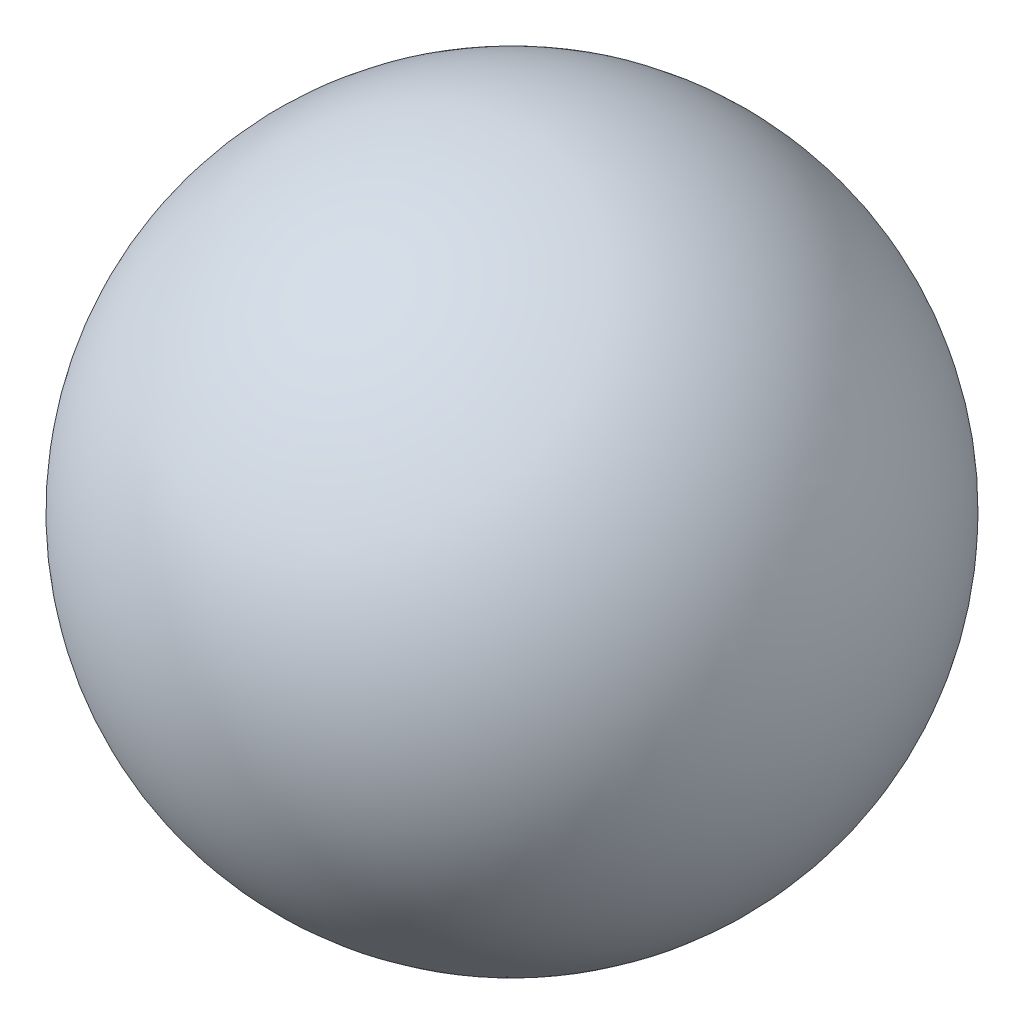
ISO-10303-21;
HEADER;
FILE_DESCRIPTION(('STEP AP214'),'2;1');
FILE_NAME('part.step','',(''),(''),'','','');
FILE_SCHEMA(('AUTOMOTIVE_DESIGN { 1 0 10303 214 1 1 1 1 }'));
ENDSEC;
DATA;
#1=APPLICATION_CONTEXT('core data for automotive mechanical design processes');
#2=APPLICATION_PROTOCOL_DEFINITION('international standard','automotive_design',2000,#1);
#3=PRODUCT_CONTEXT('',#1,'mechanical');
#4=PRODUCT('Part','Part','',(#3));
#5=PRODUCT_RELATED_PRODUCT_CATEGORY('part','',(#4));
#6=PRODUCT_DEFINITION_FORMATION('','',#4);
#7=PRODUCT_DEFINITION_CONTEXT('part definition',#1,'design');
#8=PRODUCT_DEFINITION('design','',#6,#7);
#9=PRODUCT_DEFINITION_SHAPE('','',#8);
#10=(LENGTH_UNIT() NAMED_UNIT(*) SI_UNIT(.MILLI.,.METRE.));
#11=(NAMED_UNIT(*) PLANE_ANGLE_UNIT() SI_UNIT($,.RADIAN.));
#12=(NAMED_UNIT(*) SI_UNIT($,.STERADIAN.) SOLID_ANGLE_UNIT());
#13=UNCERTAINTY_MEASURE_WITH_UNIT(LENGTH_MEASURE(1.E-05),#10,'distance_accuracy_value','');
#14=(GEOMETRIC_REPRESENTATION_CONTEXT(3) GLOBAL_UNCERTAINTY_ASSIGNED_CONTEXT((#13)) GLOBAL_UNIT_ASSIGNED_CONTEXT((#10,
#11,#12)) REPRESENTATION_CONTEXT('',''));
#15=CARTESIAN_POINT('',(0.,0.,0.));
#16=DIRECTION('',(0.,0.,1.));
#17=DIRECTION('',(1.,0.,0.));
#18=AXIS2_PLACEMENT_3D('',#15,#16,#17);
#19=CARTESIAN_POINT('',(0.,-6.45,0.));
#20=DIRECTION('',(0.,1.,0.));
#21=DIRECTION('',(-1.,0.,0.));
#22=AXIS2_PLACEMENT_3D('',#19,#20,#21);
#23=PLANE('',#22);
#24=CARTESIAN_POINT('',(0.,-6.45,0.));
#25=DIRECTION('',(0.,1.,0.));
#26=DIRECTION('',(1.,0.,0.));
#27=AXIS2_PLACEMENT_3D('',#24,#25,#26);
#28=CIRCLE('',#27,2.5);
#29=CARTESIAN_POINT('',(2.5,-6.45,0.));
#30=VERTEX_POINT('',#29);
#31=EDGE_CURVE('E45',#30,#30,#28,.T.);
#32=ORIENTED_EDGE('',*,*,#31,.T.);
#33=EDGE_LOOP('',(#32));
#34=FACE_BOUND('',#33,.T.);
#35=CARTESIAN_POINT('',(0.,-6.45,0.));
#36=DIRECTION('',(0.,-1.,0.));
#37=DIRECTION('',(-1.,0.,0.));
#38=AXIS2_PLACEMENT_3D('',#35,#36,#37);
#39=CIRCLE('',#38,2.71983455379183);
#40=CARTESIAN_POINT('',(-2.71983455379183,-6.45,0.));
#41=VERTEX_POINT('',#40);
#42=EDGE_CURVE('E10',#41,#41,#39,.T.);
#43=ORIENTED_EDGE('',*,*,#42,.T.);
#44=EDGE_LOOP('',(#43));
#45=FACE_BOUND('',#44,.T.);
#46=ADVANCED_FACE('F35',(#34,#45),#23,.F.);
#47=CARTESIAN_POINT('',(0.,0.,0.));
#48=DIRECTION('',(0.,1.,0.));
#49=DIRECTION('',(1.,0.,0.));
#50=AXIS2_PLACEMENT_3D('',#47,#48,#49);
#51=SPHERICAL_SURFACE('',#50,7.);
#52=ORIENTED_EDGE('',*,*,#42,.F.);
#53=EDGE_LOOP('',(#52));
#54=FACE_BOUND('',#53,.T.);
#55=ADVANCED_FACE('F56',(#54),#51,.T.);
#56=CARTESIAN_POINT('',(0.,-1.45,0.));
#57=DIRECTION('',(0.,-1.,0.));
#58=DIRECTION('',(1.,0.,0.));
#59=AXIS2_PLACEMENT_3D('',#56,#57,#58);
#60=CYLINDRICAL_SURFACE('',#59,2.5);
#61=CARTESIAN_POINT('',(0.,-1.45,0.));
#62=DIRECTION('',(0.,1.,0.));
#63=DIRECTION('',(1.,0.,0.));
#64=AXIS2_PLACEMENT_3D('',#61,#62,#63);
#65=CIRCLE('',#64,2.5);
#66=CARTESIAN_POINT('',(2.5,-1.45,0.));
#67=VERTEX_POINT('',#66);
#68=EDGE_CURVE('E41',#67,#67,#65,.T.);
#69=ORIENTED_EDGE('',*,*,#68,.T.);
#70=EDGE_LOOP('',(#69));
#71=FACE_BOUND('',#70,.T.);
#72=ORIENTED_EDGE('',*,*,#31,.F.);
#73=EDGE_LOOP('',(#72));
#74=FACE_BOUND('',#73,.T.);
#75=ADVANCED_FACE('F53',(#71,#74),#60,.F.);
#76=CARTESIAN_POINT('',(0.,-1.45,0.));
#77=DIRECTION('',(0.,-1.,0.));
#78=DIRECTION('',(1.,0.,0.));
#79=AXIS2_PLACEMENT_3D('',#76,#77,#78);
#80=PLANE('',#79);
#81=ORIENTED_EDGE('',*,*,#68,.F.);
#82=EDGE_LOOP('',(#81));
#83=FACE_BOUND('',#82,.T.);
#84=ADVANCED_FACE('F55',(#83),#80,.T.);
#85=CLOSED_SHELL('',(#46,#55,#75,#84));
#86=MANIFOLD_SOLID_BREP('B2',#85);
#87=ADVANCED_BREP_SHAPE_REPRESENTATION('',(#18,#86),#14);
#88=SHAPE_DEFINITION_REPRESENTATION(#9,#87);
ENDSEC;
END-ISO-10303-21;
